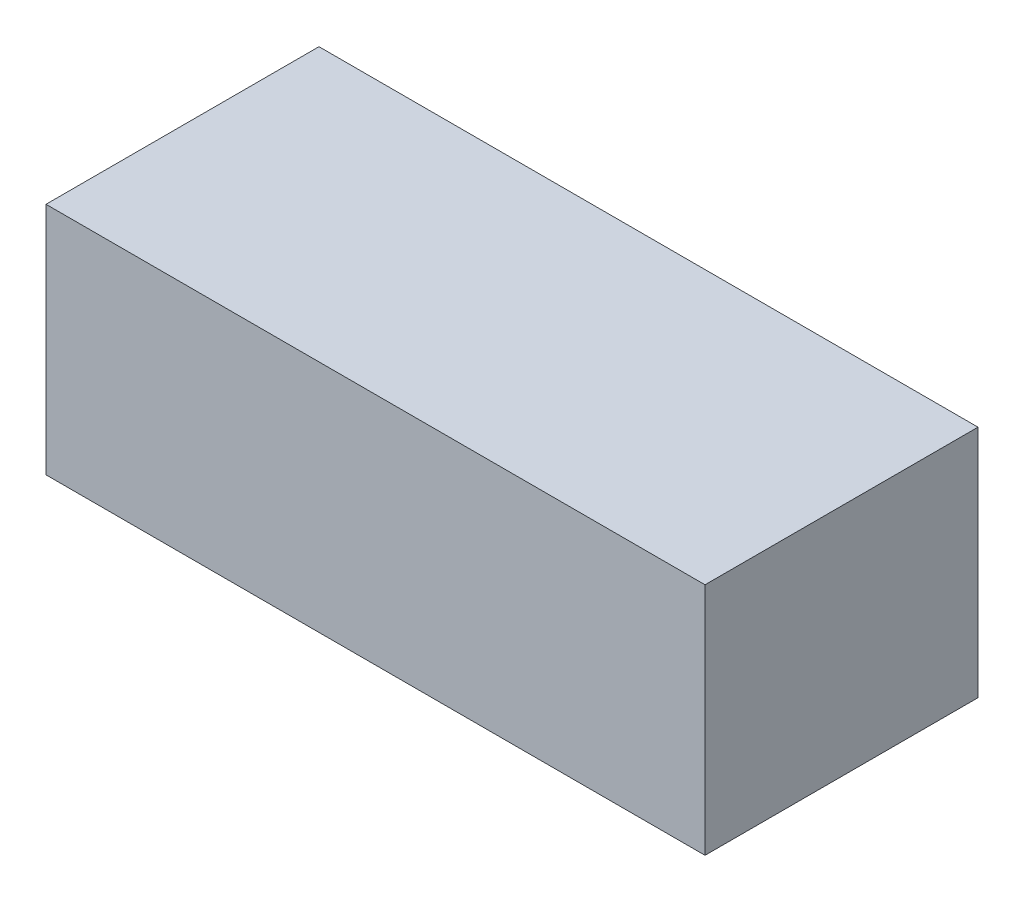
ISO-10303-21;
HEADER;
FILE_DESCRIPTION(('STEP AP214'),'2;1');
FILE_NAME('part.step','',(''),(''),'','','');
FILE_SCHEMA(('AUTOMOTIVE_DESIGN { 1 0 10303 214 1 1 1 1 }'));
ENDSEC;
DATA;
#1=APPLICATION_CONTEXT('core data for automotive mechanical design processes');
#2=APPLICATION_PROTOCOL_DEFINITION('international standard','automotive_design',2000,#1);
#3=PRODUCT_CONTEXT('',#1,'mechanical');
#4=PRODUCT('Part','Part','',(#3));
#5=PRODUCT_RELATED_PRODUCT_CATEGORY('part','',(#4));
#6=PRODUCT_DEFINITION_FORMATION('','',#4);
#7=PRODUCT_DEFINITION_CONTEXT('part definition',#1,'design');
#8=PRODUCT_DEFINITION('design','',#6,#7);
#9=PRODUCT_DEFINITION_SHAPE('','',#8);
#10=(LENGTH_UNIT() NAMED_UNIT(*) SI_UNIT(.MILLI.,.METRE.));
#11=(NAMED_UNIT(*) PLANE_ANGLE_UNIT() SI_UNIT($,.RADIAN.));
#12=(NAMED_UNIT(*) SI_UNIT($,.STERADIAN.) SOLID_ANGLE_UNIT());
#13=UNCERTAINTY_MEASURE_WITH_UNIT(LENGTH_MEASURE(1.E-05),#10,'distance_accuracy_value','');
#14=(GEOMETRIC_REPRESENTATION_CONTEXT(3) GLOBAL_UNCERTAINTY_ASSIGNED_CONTEXT((#13)) GLOBAL_UNIT_ASSIGNED_CONTEXT((#10,
#11,#12)) REPRESENTATION_CONTEXT('',''));
#15=CARTESIAN_POINT('',(0.,0.,0.));
#16=DIRECTION('',(0.,0.,1.));
#17=DIRECTION('',(1.,0.,0.));
#18=AXIS2_PLACEMENT_3D('',#15,#16,#17);
#19=CARTESIAN_POINT('',(28.575,10.16,11.8364));
#20=DIRECTION('',(-1.,0.,0.));
#21=DIRECTION('',(0.,0.,1.));
#22=AXIS2_PLACEMENT_3D('',#19,#20,#21);
#23=PLANE('',#22);
#24=DIRECTION('',(0.,0.,-1.));
#25=VECTOR('',#24,1.);
#26=CARTESIAN_POINT('',(28.575,-10.16,11.8364));
#27=LINE('',#26,#25);
#28=CARTESIAN_POINT('',(28.575,-10.16,11.8364));
#29=VERTEX_POINT('',#28);
#30=CARTESIAN_POINT('',(28.575,-10.16,-11.8364));
#31=VERTEX_POINT('',#30);
#32=EDGE_CURVE('E102',#29,#31,#27,.T.);
#33=ORIENTED_EDGE('',*,*,#32,.T.);
#34=DIRECTION('',(0.,-1.,0.));
#35=VECTOR('',#34,1.);
#36=CARTESIAN_POINT('',(28.575,10.16,-11.8364));
#37=LINE('',#36,#35);
#38=CARTESIAN_POINT('',(28.575,10.16,-11.8364));
#39=VERTEX_POINT('',#38);
#40=EDGE_CURVE('E11',#39,#31,#37,.T.);
#41=ORIENTED_EDGE('',*,*,#40,.F.);
#42=DIRECTION('',(0.,0.,-1.));
#43=VECTOR('',#42,1.);
#44=CARTESIAN_POINT('',(28.575,10.16,11.8364));
#45=LINE('',#44,#43);
#46=CARTESIAN_POINT('',(28.575,10.16,11.8364));
#47=VERTEX_POINT('',#46);
#48=EDGE_CURVE('E90',#47,#39,#45,.T.);
#49=ORIENTED_EDGE('',*,*,#48,.F.);
#50=DIRECTION('',(0.,-1.,0.));
#51=VECTOR('',#50,1.);
#52=CARTESIAN_POINT('',(28.575,10.16,11.8364));
#53=LINE('',#52,#51);
#54=EDGE_CURVE('E98',#47,#29,#53,.T.);
#55=ORIENTED_EDGE('',*,*,#54,.T.);
#56=EDGE_LOOP('',(#33,#41,#49,#55));
#57=FACE_BOUND('',#56,.T.);
#58=ADVANCED_FACE('F39',(#57),#23,.F.);
#59=CARTESIAN_POINT('',(-28.575,10.16,-11.8364));
#60=DIRECTION('',(0.,0.,1.));
#61=DIRECTION('',(1.,0.,0.));
#62=AXIS2_PLACEMENT_3D('',#59,#60,#61);
#63=PLANE('',#62);
#64=DIRECTION('',(-1.,0.,0.));
#65=VECTOR('',#64,1.);
#66=CARTESIAN_POINT('',(-28.575,-10.16,-11.8364));
#67=LINE('',#66,#65);
#68=CARTESIAN_POINT('',(-28.575,-10.16,-11.8364));
#69=VERTEX_POINT('',#68);
#70=EDGE_CURVE('E94',#31,#69,#67,.T.);
#71=ORIENTED_EDGE('',*,*,#70,.T.);
#72=DIRECTION('',(0.,-1.,0.));
#73=VECTOR('',#72,1.);
#74=CARTESIAN_POINT('',(-28.575,10.16,-11.8364));
#75=LINE('',#74,#73);
#76=CARTESIAN_POINT('',(-28.575,10.16,-11.8364));
#77=VERTEX_POINT('',#76);
#78=EDGE_CURVE('E47',#77,#69,#75,.T.);
#79=ORIENTED_EDGE('',*,*,#78,.F.);
#80=DIRECTION('',(-1.,0.,0.));
#81=VECTOR('',#80,1.);
#82=CARTESIAN_POINT('',(-28.575,10.16,-11.8364));
#83=LINE('',#82,#81);
#84=EDGE_CURVE('E85',#39,#77,#83,.T.);
#85=ORIENTED_EDGE('',*,*,#84,.F.);
#86=ORIENTED_EDGE('',*,*,#40,.T.);
#87=EDGE_LOOP('',(#71,#79,#85,#86));
#88=FACE_BOUND('',#87,.T.);
#89=ADVANCED_FACE('F93',(#88),#63,.F.);
#90=CARTESIAN_POINT('',(-28.575,10.16,11.8364));
#91=DIRECTION('',(1.,0.,0.));
#92=DIRECTION('',(0.,0.,-1.));
#93=AXIS2_PLACEMENT_3D('',#90,#91,#92);
#94=PLANE('',#93);
#95=DIRECTION('',(0.,0.,1.));
#96=VECTOR('',#95,1.);
#97=CARTESIAN_POINT('',(-28.575,-10.16,11.8364));
#98=LINE('',#97,#96);
#99=CARTESIAN_POINT('',(-28.575,-10.16,11.8364));
#100=VERTEX_POINT('',#99);
#101=EDGE_CURVE('E72',#69,#100,#98,.T.);
#102=ORIENTED_EDGE('',*,*,#101,.T.);
#103=DIRECTION('',(0.,-1.,0.));
#104=VECTOR('',#103,1.);
#105=CARTESIAN_POINT('',(-28.575,10.16,11.8364));
#106=LINE('',#105,#104);
#107=CARTESIAN_POINT('',(-28.575,10.16,11.8364));
#108=VERTEX_POINT('',#107);
#109=EDGE_CURVE('E95',#108,#100,#106,.T.);
#110=ORIENTED_EDGE('',*,*,#109,.F.);
#111=DIRECTION('',(0.,0.,1.));
#112=VECTOR('',#111,1.);
#113=CARTESIAN_POINT('',(-28.575,10.16,11.8364));
#114=LINE('',#113,#112);
#115=EDGE_CURVE('E88',#77,#108,#114,.T.);
#116=ORIENTED_EDGE('',*,*,#115,.F.);
#117=ORIENTED_EDGE('',*,*,#78,.T.);
#118=EDGE_LOOP('',(#102,#110,#116,#117));
#119=FACE_BOUND('',#118,.T.);
#120=ADVANCED_FACE('F96',(#119),#94,.F.);
#121=CARTESIAN_POINT('',(-28.575,10.16,11.8364));
#122=DIRECTION('',(0.,0.,-1.));
#123=DIRECTION('',(-1.,0.,0.));
#124=AXIS2_PLACEMENT_3D('',#121,#122,#123);
#125=PLANE('',#124);
#126=DIRECTION('',(1.,0.,0.));
#127=VECTOR('',#126,1.);
#128=CARTESIAN_POINT('',(-28.575,-10.16,11.8364));
#129=LINE('',#128,#127);
#130=EDGE_CURVE('E78',#100,#29,#129,.T.);
#131=ORIENTED_EDGE('',*,*,#130,.T.);
#132=ORIENTED_EDGE('',*,*,#54,.F.);
#133=DIRECTION('',(1.,0.,0.));
#134=VECTOR('',#133,1.);
#135=CARTESIAN_POINT('',(-28.575,10.16,11.8364));
#136=LINE('',#135,#134);
#137=EDGE_CURVE('E55',#108,#47,#136,.T.);
#138=ORIENTED_EDGE('',*,*,#137,.F.);
#139=ORIENTED_EDGE('',*,*,#109,.T.);
#140=EDGE_LOOP('',(#131,#132,#138,#139));
#141=FACE_BOUND('',#140,.T.);
#142=ADVANCED_FACE('F109',(#141),#125,.F.);
#143=CARTESIAN_POINT('',(0.,10.16,0.));
#144=DIRECTION('',(0.,-1.,0.));
#145=DIRECTION('',(0.,0.,-1.));
#146=AXIS2_PLACEMENT_3D('',#143,#144,#145);
#147=PLANE('',#146);
#148=ORIENTED_EDGE('',*,*,#48,.T.);
#149=ORIENTED_EDGE('',*,*,#84,.T.);
#150=ORIENTED_EDGE('',*,*,#115,.T.);
#151=ORIENTED_EDGE('',*,*,#137,.T.);
#152=EDGE_LOOP('',(#148,#149,#150,#151));
#153=FACE_BOUND('',#152,.T.);
#154=ADVANCED_FACE('F86',(#153),#147,.F.);
#155=CARTESIAN_POINT('',(0.,-10.16,0.));
#156=DIRECTION('',(0.,-1.,0.));
#157=DIRECTION('',(0.,0.,-1.));
#158=AXIS2_PLACEMENT_3D('',#155,#156,#157);
#159=PLANE('',#158);
#160=ORIENTED_EDGE('',*,*,#32,.F.);
#161=ORIENTED_EDGE('',*,*,#130,.F.);
#162=ORIENTED_EDGE('',*,*,#101,.F.);
#163=ORIENTED_EDGE('',*,*,#70,.F.);
#164=EDGE_LOOP('',(#160,#161,#162,#163));
#165=FACE_BOUND('',#164,.T.);
#166=ADVANCED_FACE('F112',(#165),#159,.T.);
#167=CLOSED_SHELL('',(#58,#89,#120,#142,#154,#166));
#168=MANIFOLD_SOLID_BREP('B2',#167);
#169=ADVANCED_BREP_SHAPE_REPRESENTATION('',(#18,#168),#14);
#170=SHAPE_DEFINITION_REPRESENTATION(#9,#169);
ENDSEC;
END-ISO-10303-21;
